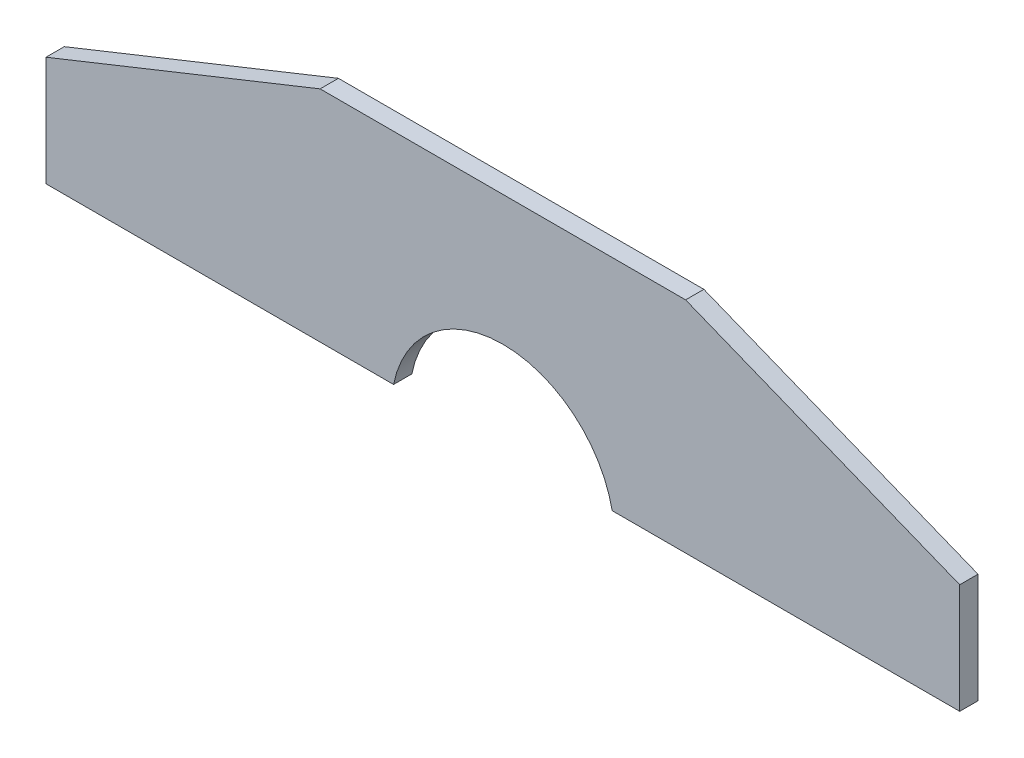
ISO-10303-21;
HEADER;
FILE_DESCRIPTION(('STEP AP214'),'2;1');
FILE_NAME('part.step','',(''),(''),'','','');
FILE_SCHEMA(('AUTOMOTIVE_DESIGN { 1 0 10303 214 1 1 1 1 }'));
ENDSEC;
DATA;
#1=APPLICATION_CONTEXT('core data for automotive mechanical design processes');
#2=APPLICATION_PROTOCOL_DEFINITION('international standard','automotive_design',2000,#1);
#3=PRODUCT_CONTEXT('',#1,'mechanical');
#4=PRODUCT('Part','Part','',(#3));
#5=PRODUCT_RELATED_PRODUCT_CATEGORY('part','',(#4));
#6=PRODUCT_DEFINITION_FORMATION('','',#4);
#7=PRODUCT_DEFINITION_CONTEXT('part definition',#1,'design');
#8=PRODUCT_DEFINITION('design','',#6,#7);
#9=PRODUCT_DEFINITION_SHAPE('','',#8);
#10=(LENGTH_UNIT() NAMED_UNIT(*) SI_UNIT(.MILLI.,.METRE.));
#11=(NAMED_UNIT(*) PLANE_ANGLE_UNIT() SI_UNIT($,.RADIAN.));
#12=(NAMED_UNIT(*) SI_UNIT($,.STERADIAN.) SOLID_ANGLE_UNIT());
#13=UNCERTAINTY_MEASURE_WITH_UNIT(LENGTH_MEASURE(1.E-05),#10,'distance_accuracy_value','');
#14=(GEOMETRIC_REPRESENTATION_CONTEXT(3) GLOBAL_UNCERTAINTY_ASSIGNED_CONTEXT((#13)) GLOBAL_UNIT_ASSIGNED_CONTEXT((#10,
#11,#12)) REPRESENTATION_CONTEXT('',''));
#15=CARTESIAN_POINT('',(0.,0.,0.));
#16=DIRECTION('',(0.,0.,1.));
#17=DIRECTION('',(1.,0.,0.));
#18=AXIS2_PLACEMENT_3D('',#15,#16,#17);
#19=CARTESIAN_POINT('',(-125.,6.,5.));
#20=DIRECTION('',(1.,0.,0.));
#21=DIRECTION('',(0.,0.,-1.));
#22=AXIS2_PLACEMENT_3D('',#19,#20,#21);
#23=PLANE('',#22);
#24=DIRECTION('',(0.,-1.,0.));
#25=VECTOR('',#24,1.);
#26=CARTESIAN_POINT('',(-125.,6.,0.));
#27=LINE('',#26,#25);
#28=CARTESIAN_POINT('',(-125.,36.,0.));
#29=VERTEX_POINT('',#28);
#30=CARTESIAN_POINT('',(-125.,6.,0.));
#31=VERTEX_POINT('',#30);
#32=EDGE_CURVE('E131',#29,#31,#27,.T.);
#33=ORIENTED_EDGE('',*,*,#32,.T.);
#34=DIRECTION('',(0.,0.,-1.));
#35=VECTOR('',#34,1.);
#36=CARTESIAN_POINT('',(-125.,6.,5.));
#37=LINE('',#36,#35);
#38=CARTESIAN_POINT('',(-125.,6.,5.));
#39=VERTEX_POINT('',#38);
#40=EDGE_CURVE('E11',#39,#31,#37,.T.);
#41=ORIENTED_EDGE('',*,*,#40,.F.);
#42=DIRECTION('',(0.,-1.,0.));
#43=VECTOR('',#42,1.);
#44=CARTESIAN_POINT('',(-125.,6.,5.));
#45=LINE('',#44,#43);
#46=CARTESIAN_POINT('',(-125.,36.,5.));
#47=VERTEX_POINT('',#46);
#48=EDGE_CURVE('E145',#47,#39,#45,.T.);
#49=ORIENTED_EDGE('',*,*,#48,.F.);
#50=DIRECTION('',(0.,0.,-1.));
#51=VECTOR('',#50,1.);
#52=CARTESIAN_POINT('',(-125.,36.,5.));
#53=LINE('',#52,#51);
#54=EDGE_CURVE('E127',#47,#29,#53,.T.);
#55=ORIENTED_EDGE('',*,*,#54,.T.);
#56=EDGE_LOOP('',(#33,#41,#49,#55));
#57=FACE_BOUND('',#56,.T.);
#58=ADVANCED_FACE('F35',(#57),#23,.F.);
#59=CARTESIAN_POINT('',(-125.,6.,5.));
#60=DIRECTION('',(0.,1.,0.));
#61=DIRECTION('',(0.,0.,1.));
#62=AXIS2_PLACEMENT_3D('',#59,#60,#61);
#63=PLANE('',#62);
#64=DIRECTION('',(1.,0.,0.));
#65=VECTOR('',#64,1.);
#66=CARTESIAN_POINT('',(-125.,6.,0.));
#67=LINE('',#66,#65);
#68=CARTESIAN_POINT('',(-29.9040131086114,6.,0.));
#69=VERTEX_POINT('',#68);
#70=EDGE_CURVE('E134',#31,#69,#67,.T.);
#71=ORIENTED_EDGE('',*,*,#70,.T.);
#72=DIRECTION('',(0.,0.,-1.));
#73=VECTOR('',#72,1.);
#74=CARTESIAN_POINT('',(-29.9040131086114,6.,5.));
#75=LINE('',#74,#73);
#76=CARTESIAN_POINT('',(-29.9040131086114,6.,5.));
#77=VERTEX_POINT('',#76);
#78=EDGE_CURVE('E43',#77,#69,#75,.T.);
#79=ORIENTED_EDGE('',*,*,#78,.F.);
#80=DIRECTION('',(1.,0.,0.));
#81=VECTOR('',#80,1.);
#82=CARTESIAN_POINT('',(-125.,6.,5.));
#83=LINE('',#82,#81);
#84=EDGE_CURVE('E94',#39,#77,#83,.T.);
#85=ORIENTED_EDGE('',*,*,#84,.F.);
#86=ORIENTED_EDGE('',*,*,#40,.T.);
#87=EDGE_LOOP('',(#71,#79,#85,#86));
#88=FACE_BOUND('',#87,.T.);
#89=ADVANCED_FACE('F180',(#88),#63,.F.);
#90=CARTESIAN_POINT('',(0.,0.,5.));
#91=DIRECTION('',(0.,0.,-1.));
#92=DIRECTION('',(-1.,0.,0.));
#93=AXIS2_PLACEMENT_3D('',#90,#91,#92);
#94=CYLINDRICAL_SURFACE('',#93,30.5);
#95=CARTESIAN_POINT('',(0.,0.,0.));
#96=DIRECTION('',(0.,0.,-1.));
#97=DIRECTION('',(1.,0.,0.));
#98=AXIS2_PLACEMENT_3D('',#95,#96,#97);
#99=CIRCLE('',#98,30.5);
#100=CARTESIAN_POINT('',(29.9040131086114,6.,0.));
#101=VERTEX_POINT('',#100);
#102=EDGE_CURVE('E136',#69,#101,#99,.T.);
#103=ORIENTED_EDGE('',*,*,#102,.T.);
#104=DIRECTION('',(0.,0.,-1.));
#105=VECTOR('',#104,1.);
#106=CARTESIAN_POINT('',(29.9040131086114,6.,5.));
#107=LINE('',#106,#105);
#108=CARTESIAN_POINT('',(29.9040131086114,6.,5.));
#109=VERTEX_POINT('',#108);
#110=EDGE_CURVE('E152',#109,#101,#107,.T.);
#111=ORIENTED_EDGE('',*,*,#110,.F.);
#112=CARTESIAN_POINT('',(0.,0.,5.));
#113=DIRECTION('',(0.,0.,-1.));
#114=DIRECTION('',(1.,0.,0.));
#115=AXIS2_PLACEMENT_3D('',#112,#113,#114);
#116=CIRCLE('',#115,30.5);
#117=EDGE_CURVE('E160',#77,#109,#116,.T.);
#118=ORIENTED_EDGE('',*,*,#117,.F.);
#119=ORIENTED_EDGE('',*,*,#78,.T.);
#120=EDGE_LOOP('',(#103,#111,#118,#119));
#121=FACE_BOUND('',#120,.T.);
#122=ADVANCED_FACE('F158',(#121),#94,.F.);
#123=CARTESIAN_POINT('',(29.9040131086114,6.,5.));
#124=DIRECTION('',(0.,1.,0.));
#125=DIRECTION('',(0.,0.,1.));
#126=AXIS2_PLACEMENT_3D('',#123,#124,#125);
#127=PLANE('',#126);
#128=DIRECTION('',(1.,0.,0.));
#129=VECTOR('',#128,1.);
#130=CARTESIAN_POINT('',(29.9040131086114,6.,0.));
#131=LINE('',#130,#129);
#132=CARTESIAN_POINT('',(125.,6.,0.));
#133=VERTEX_POINT('',#132);
#134=EDGE_CURVE('E138',#101,#133,#131,.T.);
#135=ORIENTED_EDGE('',*,*,#134,.T.);
#136=DIRECTION('',(0.,0.,-1.));
#137=VECTOR('',#136,1.);
#138=CARTESIAN_POINT('',(125.,6.,5.));
#139=LINE('',#138,#137);
#140=CARTESIAN_POINT('',(125.,6.,5.));
#141=VERTEX_POINT('',#140);
#142=EDGE_CURVE('E149',#141,#133,#139,.T.);
#143=ORIENTED_EDGE('',*,*,#142,.F.);
#144=DIRECTION('',(1.,0.,0.));
#145=VECTOR('',#144,1.);
#146=CARTESIAN_POINT('',(29.9040131086114,6.,5.));
#147=LINE('',#146,#145);
#148=EDGE_CURVE('E172',#109,#141,#147,.T.);
#149=ORIENTED_EDGE('',*,*,#148,.F.);
#150=ORIENTED_EDGE('',*,*,#110,.T.);
#151=EDGE_LOOP('',(#135,#143,#149,#150));
#152=FACE_BOUND('',#151,.T.);
#153=ADVANCED_FACE('F168',(#152),#127,.F.);
#154=CARTESIAN_POINT('',(125.,6.,5.));
#155=DIRECTION('',(-1.,0.,0.));
#156=DIRECTION('',(0.,0.,1.));
#157=AXIS2_PLACEMENT_3D('',#154,#155,#156);
#158=PLANE('',#157);
#159=DIRECTION('',(0.,1.,0.));
#160=VECTOR('',#159,1.);
#161=CARTESIAN_POINT('',(125.,6.,0.));
#162=LINE('',#161,#160);
#163=CARTESIAN_POINT('',(125.,36.,0.));
#164=VERTEX_POINT('',#163);
#165=EDGE_CURVE('E140',#133,#164,#162,.T.);
#166=ORIENTED_EDGE('',*,*,#165,.T.);
#167=DIRECTION('',(0.,0.,-1.));
#168=VECTOR('',#167,1.);
#169=CARTESIAN_POINT('',(125.,36.,5.));
#170=LINE('',#169,#168);
#171=CARTESIAN_POINT('',(125.,36.,5.));
#172=VERTEX_POINT('',#171);
#173=EDGE_CURVE('E122',#172,#164,#170,.T.);
#174=ORIENTED_EDGE('',*,*,#173,.F.);
#175=DIRECTION('',(0.,1.,0.));
#176=VECTOR('',#175,1.);
#177=CARTESIAN_POINT('',(125.,6.,5.));
#178=LINE('',#177,#176);
#179=EDGE_CURVE('E113',#141,#172,#178,.T.);
#180=ORIENTED_EDGE('',*,*,#179,.F.);
#181=ORIENTED_EDGE('',*,*,#142,.T.);
#182=EDGE_LOOP('',(#166,#174,#180,#181));
#183=FACE_BOUND('',#182,.T.);
#184=ADVANCED_FACE('F171',(#183),#158,.F.);
#185=CARTESIAN_POINT('',(50.,66.,5.));
#186=DIRECTION('',(-0.371390676354104,-0.928476690885259,0.));
#187=DIRECTION('',(0.928476690885259,-0.371390676354104,0.));
#188=AXIS2_PLACEMENT_3D('',#185,#186,#187);
#189=PLANE('',#188);
#190=DIRECTION('',(-0.928476690885259,0.371390676354104,0.));
#191=VECTOR('',#190,1.);
#192=CARTESIAN_POINT('',(50.,66.,0.));
#193=LINE('',#192,#191);
#194=CARTESIAN_POINT('',(50.,66.,0.));
#195=VERTEX_POINT('',#194);
#196=EDGE_CURVE('E121',#164,#195,#193,.T.);
#197=ORIENTED_EDGE('',*,*,#196,.T.);
#198=DIRECTION('',(0.,0.,-1.));
#199=VECTOR('',#198,1.);
#200=CARTESIAN_POINT('',(50.,66.,5.));
#201=LINE('',#200,#199);
#202=CARTESIAN_POINT('',(50.,66.,5.));
#203=VERTEX_POINT('',#202);
#204=EDGE_CURVE('E118',#203,#195,#201,.T.);
#205=ORIENTED_EDGE('',*,*,#204,.F.);
#206=DIRECTION('',(-0.928476690885259,0.371390676354104,0.));
#207=VECTOR('',#206,1.);
#208=CARTESIAN_POINT('',(50.,66.,5.));
#209=LINE('',#208,#207);
#210=EDGE_CURVE('E107',#172,#203,#209,.T.);
#211=ORIENTED_EDGE('',*,*,#210,.F.);
#212=ORIENTED_EDGE('',*,*,#173,.T.);
#213=EDGE_LOOP('',(#197,#205,#211,#212));
#214=FACE_BOUND('',#213,.T.);
#215=ADVANCED_FACE('F119',(#214),#189,.F.);
#216=CARTESIAN_POINT('',(-50.,66.,5.));
#217=DIRECTION('',(0.,-1.,0.));
#218=DIRECTION('',(0.,0.,-1.));
#219=AXIS2_PLACEMENT_3D('',#216,#217,#218);
#220=PLANE('',#219);
#221=DIRECTION('',(-1.,0.,0.));
#222=VECTOR('',#221,1.);
#223=CARTESIAN_POINT('',(-50.,66.,0.));
#224=LINE('',#223,#222);
#225=CARTESIAN_POINT('',(-50.,66.,0.));
#226=VERTEX_POINT('',#225);
#227=EDGE_CURVE('E80',#195,#226,#224,.T.);
#228=ORIENTED_EDGE('',*,*,#227,.T.);
#229=DIRECTION('',(0.,0.,-1.));
#230=VECTOR('',#229,1.);
#231=CARTESIAN_POINT('',(-50.,66.,5.));
#232=LINE('',#231,#230);
#233=CARTESIAN_POINT('',(-50.,66.,5.));
#234=VERTEX_POINT('',#233);
#235=EDGE_CURVE('E123',#234,#226,#232,.T.);
#236=ORIENTED_EDGE('',*,*,#235,.F.);
#237=DIRECTION('',(-1.,0.,0.));
#238=VECTOR('',#237,1.);
#239=CARTESIAN_POINT('',(-50.,66.,5.));
#240=LINE('',#239,#238);
#241=EDGE_CURVE('E111',#203,#234,#240,.T.);
#242=ORIENTED_EDGE('',*,*,#241,.F.);
#243=ORIENTED_EDGE('',*,*,#204,.T.);
#244=EDGE_LOOP('',(#228,#236,#242,#243));
#245=FACE_BOUND('',#244,.T.);
#246=ADVANCED_FACE('F125',(#245),#220,.F.);
#247=CARTESIAN_POINT('',(-125.,36.,5.));
#248=DIRECTION('',(0.371390676354104,-0.928476690885259,0.));
#249=DIRECTION('',(0.928476690885259,0.371390676354104,0.));
#250=AXIS2_PLACEMENT_3D('',#247,#248,#249);
#251=PLANE('',#250);
#252=DIRECTION('',(-0.928476690885259,-0.371390676354104,0.));
#253=VECTOR('',#252,1.);
#254=CARTESIAN_POINT('',(-125.,36.,0.));
#255=LINE('',#254,#253);
#256=EDGE_CURVE('E86',#226,#29,#255,.T.);
#257=ORIENTED_EDGE('',*,*,#256,.T.);
#258=ORIENTED_EDGE('',*,*,#54,.F.);
#259=DIRECTION('',(-0.928476690885259,-0.371390676354104,0.));
#260=VECTOR('',#259,1.);
#261=CARTESIAN_POINT('',(-125.,36.,5.));
#262=LINE('',#261,#260);
#263=EDGE_CURVE('E51',#234,#47,#262,.T.);
#264=ORIENTED_EDGE('',*,*,#263,.F.);
#265=ORIENTED_EDGE('',*,*,#235,.T.);
#266=EDGE_LOOP('',(#257,#258,#264,#265));
#267=FACE_BOUND('',#266,.T.);
#268=ADVANCED_FACE('F196',(#267),#251,.F.);
#269=CARTESIAN_POINT('',(0.,0.,5.));
#270=DIRECTION('',(0.,0.,1.));
#271=DIRECTION('',(1.,0.,0.));
#272=AXIS2_PLACEMENT_3D('',#269,#270,#271);
#273=PLANE('',#272);
#274=ORIENTED_EDGE('',*,*,#48,.T.);
#275=ORIENTED_EDGE('',*,*,#84,.T.);
#276=ORIENTED_EDGE('',*,*,#117,.T.);
#277=ORIENTED_EDGE('',*,*,#148,.T.);
#278=ORIENTED_EDGE('',*,*,#179,.T.);
#279=ORIENTED_EDGE('',*,*,#210,.T.);
#280=ORIENTED_EDGE('',*,*,#241,.T.);
#281=ORIENTED_EDGE('',*,*,#263,.T.);
#282=EDGE_LOOP('',(#274,#275,#276,#277,#278,#279,#280,#281));
#283=FACE_BOUND('',#282,.T.);
#284=ADVANCED_FACE('F109',(#283),#273,.T.);
#285=CARTESIAN_POINT('',(0.,0.,0.));
#286=DIRECTION('',(0.,0.,1.));
#287=DIRECTION('',(1.,0.,0.));
#288=AXIS2_PLACEMENT_3D('',#285,#286,#287);
#289=PLANE('',#288);
#290=ORIENTED_EDGE('',*,*,#32,.F.);
#291=ORIENTED_EDGE('',*,*,#256,.F.);
#292=ORIENTED_EDGE('',*,*,#227,.F.);
#293=ORIENTED_EDGE('',*,*,#196,.F.);
#294=ORIENTED_EDGE('',*,*,#165,.F.);
#295=ORIENTED_EDGE('',*,*,#134,.F.);
#296=ORIENTED_EDGE('',*,*,#102,.F.);
#297=ORIENTED_EDGE('',*,*,#70,.F.);
#298=EDGE_LOOP('',(#290,#291,#292,#293,#294,#295,#296,#297));
#299=FACE_BOUND('',#298,.T.);
#300=ADVANCED_FACE('F164',(#299),#289,.F.);
#301=CLOSED_SHELL('',(#58,#89,#122,#153,#184,#215,#246,#268,#284,#300));
#302=MANIFOLD_SOLID_BREP('B2',#301);
#303=ADVANCED_BREP_SHAPE_REPRESENTATION('',(#18,#302),#14);
#304=SHAPE_DEFINITION_REPRESENTATION(#9,#303);
ENDSEC;
END-ISO-10303-21;
